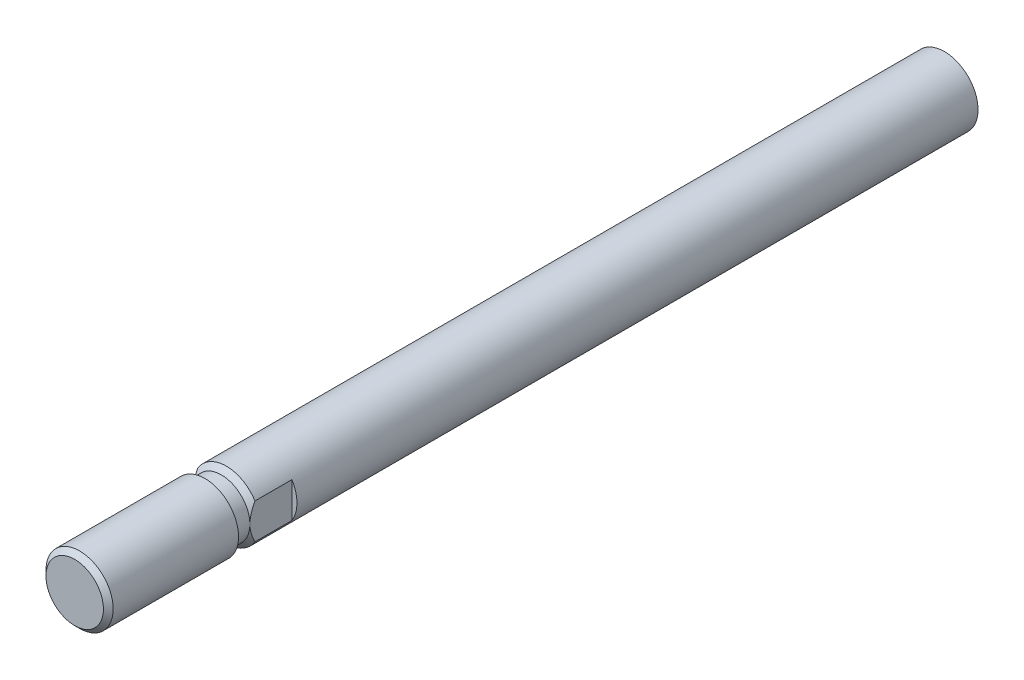
ISO-10303-21;
HEADER;
FILE_DESCRIPTION(('STEP AP214'),'2;1');
FILE_NAME('part.step','',(''),(''),'','','');
FILE_SCHEMA(('AUTOMOTIVE_DESIGN { 1 0 10303 214 1 1 1 1 }'));
ENDSEC;
DATA;
#1=APPLICATION_CONTEXT('core data for automotive mechanical design processes');
#2=APPLICATION_PROTOCOL_DEFINITION('international standard','automotive_design',2000,#1);
#3=PRODUCT_CONTEXT('',#1,'mechanical');
#4=PRODUCT('Part','Part','',(#3));
#5=PRODUCT_RELATED_PRODUCT_CATEGORY('part','',(#4));
#6=PRODUCT_DEFINITION_FORMATION('','',#4);
#7=PRODUCT_DEFINITION_CONTEXT('part definition',#1,'design');
#8=PRODUCT_DEFINITION('design','',#6,#7);
#9=PRODUCT_DEFINITION_SHAPE('','',#8);
#10=(LENGTH_UNIT() NAMED_UNIT(*) SI_UNIT(.MILLI.,.METRE.));
#11=(NAMED_UNIT(*) PLANE_ANGLE_UNIT() SI_UNIT($,.RADIAN.));
#12=(NAMED_UNIT(*) SI_UNIT($,.STERADIAN.) SOLID_ANGLE_UNIT());
#13=UNCERTAINTY_MEASURE_WITH_UNIT(LENGTH_MEASURE(1.E-05),#10,'distance_accuracy_value','');
#14=(GEOMETRIC_REPRESENTATION_CONTEXT(3) GLOBAL_UNCERTAINTY_ASSIGNED_CONTEXT((#13)) GLOBAL_UNIT_ASSIGNED_CONTEXT((#10,
#11,#12)) REPRESENTATION_CONTEXT('',''));
#15=CARTESIAN_POINT('',(0.,0.,0.));
#16=DIRECTION('',(0.,0.,1.));
#17=DIRECTION('',(1.,0.,0.));
#18=AXIS2_PLACEMENT_3D('',#15,#16,#17);
#19=CARTESIAN_POINT('',(0.,0.,61.45));
#20=DIRECTION('',(0.,0.,-1.));
#21=DIRECTION('',(-1.,0.,0.));
#22=AXIS2_PLACEMENT_3D('',#19,#20,#21);
#23=CONICAL_SURFACE('',#22,4.,0.785398163397433);
#24=CARTESIAN_POINT('',(-3.4,-6.5878219458754,58.0365394052063));
#25=CARTESIAN_POINT('',(-3.4,-6.43516483878573,58.1721735388827));
#26=CARTESIAN_POINT('',(-3.4,-6.28203328358908,58.307278839609));
#27=CARTESIAN_POINT('',(-3.4,-5.97456908677552,58.5761487678322));
#28=CARTESIAN_POINT('',(-3.4,-5.82023631661633,58.7099132482437));
#29=CARTESIAN_POINT('',(-3.4,-5.50946218616608,58.9763791654496));
#30=CARTESIAN_POINT('',(-3.4,-5.35301450640604,59.1090732460118));
#31=CARTESIAN_POINT('',(-3.4,-5.03836903359496,59.3723579204279));
#32=CARTESIAN_POINT('',(-3.4,-4.88017132739386,59.502948617885));
#33=CARTESIAN_POINT('',(-3.4,-4.55193046691828,59.7693039339672));
#34=CARTESIAN_POINT('',(-3.4,-4.38175122939598,59.9049013659342));
#35=CARTESIAN_POINT('',(-3.4,-4.03829264817203,60.172107416482));
#36=CARTESIAN_POINT('',(-3.4,-3.86501350856863,60.303716296144));
#37=CARTESIAN_POINT('',(-3.4,-3.51476446724909,60.5612887871298));
#38=CARTESIAN_POINT('',(-3.4,-3.33780168426294,60.687262030229));
#39=CARTESIAN_POINT('',(-3.4,-2.97875124820127,60.931636690709));
#40=CARTESIAN_POINT('',(-3.4,-2.79666552040638,61.0500408993241));
#41=CARTESIAN_POINT('',(-3.4,-2.48285502108162,61.2411701268405));
#42=CARTESIAN_POINT('',(-3.4,-2.35287212439924,61.3167410019718));
#43=CARTESIAN_POINT('',(-3.4,-2.08905852947589,61.4610211361091));
#44=CARTESIAN_POINT('',(-3.4,-1.9552266683874,61.5297282927997));
#45=CARTESIAN_POINT('',(-3.4,-1.6844085539287,61.6574937747855));
#46=CARTESIAN_POINT('',(-3.4,-1.54745996214771,61.7166309810592));
#47=CARTESIAN_POINT('',(-3.4,-1.26905180672446,61.823155809651));
#48=CARTESIAN_POINT('',(-3.4,-1.12759510211247,61.8705507178861));
#49=CARTESIAN_POINT('',(-3.4,-0.885218992938315,61.9379349759706));
#50=CARTESIAN_POINT('',(-3.4,-0.785396522524439,61.9618623921347));
#51=CARTESIAN_POINT('',(-3.4,-0.584138025374428,62.0015948902267));
#52=CARTESIAN_POINT('',(-3.4,-0.482702283496348,62.0174013900179));
#53=CARTESIAN_POINT('',(-3.4,-0.279164763157997,62.0400522092579));
#54=CARTESIAN_POINT('',(-3.4,-0.177066349816273,62.0469263452185));
#55=CARTESIAN_POINT('',(-3.4,0.0273389530064295,62.0514254506055));
#56=CARTESIAN_POINT('',(-3.4,0.12964584441907,62.0490503339396));
#57=CARTESIAN_POINT('',(-3.4,0.333086177366939,62.0352236825696));
#58=CARTESIAN_POINT('',(-3.4,0.434222966747206,62.0238205689356));
#59=CARTESIAN_POINT('',(-3.4,0.635194537026872,61.9926008709949));
#60=CARTESIAN_POINT('',(-3.4,0.735029000059152,61.9727822708539));
#61=CARTESIAN_POINT('',(-3.4,0.933992170496691,61.9253872286602));
#62=CARTESIAN_POINT('',(-3.4,1.0331006387697,61.8977268547021));
#63=CARTESIAN_POINT('',(-3.4,1.22919346075848,61.8358253094709));
#64=CARTESIAN_POINT('',(-3.4,1.32617821312364,61.8015853852687));
#65=CARTESIAN_POINT('',(-3.4,1.55202727156844,61.7144404589539));
#66=CARTESIAN_POINT('',(-3.4,1.67999557074098,61.6592230290004));
#67=CARTESIAN_POINT('',(-3.4,1.93225210900286,61.5408851998133));
#68=CARTESIAN_POINT('',(-3.4,2.05653823694379,61.4777603713498));
#69=CARTESIAN_POINT('',(-3.4,2.30224909620747,61.3451716649328));
#70=CARTESIAN_POINT('',(-3.4,2.42366155172895,61.2756852166232));
#71=CARTESIAN_POINT('',(-3.4,2.66358688395173,61.1319595950889));
#72=CARTESIAN_POINT('',(-3.4,2.78210033173297,61.0577213685168));
#73=CARTESIAN_POINT('',(-3.4,3.01078760711653,60.9093323105076));
#74=CARTESIAN_POINT('',(-3.4,3.1210810734865,60.8353649010318));
#75=CARTESIAN_POINT('',(-3.4,3.33980139105162,60.6847096078359));
#76=CARTESIAN_POINT('',(-3.4,3.4482280904492,60.6080215044178));
#77=CARTESIAN_POINT('',(-3.4,3.66252557724323,60.4531362116732));
#78=CARTESIAN_POINT('',(-3.4,3.76841052929652,60.3749585530628));
#79=CARTESIAN_POINT('',(-3.4,3.97880253424355,60.2168257813109));
#80=CARTESIAN_POINT('',(-3.4,4.08330994339822,60.1368711426946));
#81=CARTESIAN_POINT('',(-3.4,4.18725185941825,60.0562000283472));
#82=B_SPLINE_CURVE_WITH_KNOTS('',3,(#24,#25,#26,#27,#28,#29,#30,#31,#32,#33,#34,#35,#36,#37,#38,
#39,#40,#41,#42,#43,#44,#45,#46,#47,#48,#49,#50,#51,#52,#53,#54,#55,#56,#57,#58,#59,#60,#61,#62,
#63,#64,#65,#66,#67,#68,#69,#70,#71,#72,#73,#74,#75,#76,#77,#78,#79,#80,#81),.UNSPECIFIED.,.F.,
.F.,(4,2,2,2,2,2,2,2,2,2,2,2,2,2,2,2,2,2,2,2,2,2,2,2,2,2,2,2,4),(0.,0.612627167165252,
1.22532081858993,1.84073464995004,2.4561180754938,3.10886008900236,3.76155928285797,
4.41309664854131,5.06439234387836,5.51530342448703,5.96635219566758,6.41346955346702,
6.860308783014,7.16797223390512,7.47558195033027,7.78216219550522,8.0887452943447,
8.39369510399418,8.69871800215612,9.00713756411888,9.3154987265912,9.73325087704229,
10.1512380813149,10.5707704183088,10.990219434369,11.3885708160787,11.7869544384812,
12.1817889285951,12.5765192196432),.UNSPECIFIED.);
#83=CARTESIAN_POINT('',(-3.4,-2.10713075057055,61.45));
#84=VERTEX_POINT('',#83);
#85=CARTESIAN_POINT('',(-3.4,0.,62.05));
#86=VERTEX_POINT('',#85);
#87=EDGE_CURVE('E60',#84,#86,#82,.T.);
#88=ORIENTED_EDGE('',*,*,#87,.F.);
#89=CARTESIAN_POINT('',(0.,0.,61.45));
#90=DIRECTION('',(0.,0.,-1.));
#91=DIRECTION('',(-1.,0.,0.));
#92=AXIS2_PLACEMENT_3D('',#89,#90,#91);
#93=CIRCLE('',#92,4.);
#94=CARTESIAN_POINT('',(3.4,-2.10713075057055,61.45));
#95=VERTEX_POINT('',#94);
#96=EDGE_CURVE('E160',#95,#84,#93,.T.);
#97=ORIENTED_EDGE('',*,*,#96,.F.);
#98=CARTESIAN_POINT('',(3.4,-6.5878219458754,58.0365394052063));
#99=CARTESIAN_POINT('',(3.4,-6.43516483878573,58.1721735388827));
#100=CARTESIAN_POINT('',(3.4,-6.28203328358908,58.307278839609));
#101=CARTESIAN_POINT('',(3.4,-5.97456908677552,58.5761487678322));
#102=CARTESIAN_POINT('',(3.4,-5.82023631661633,58.7099132482436));
#103=CARTESIAN_POINT('',(3.4,-5.50946218616608,58.9763791654496));
#104=CARTESIAN_POINT('',(3.4,-5.35301450640604,59.1090732460118));
#105=CARTESIAN_POINT('',(3.4,-5.03836903359497,59.3723579204279));
#106=CARTESIAN_POINT('',(3.4,-4.88017132739386,59.502948617885));
#107=CARTESIAN_POINT('',(3.4,-4.55193046691828,59.7693039339672));
#108=CARTESIAN_POINT('',(3.4,-4.38175122939598,59.9049013659342));
#109=CARTESIAN_POINT('',(3.4,-4.03829264817204,60.172107416482));
#110=CARTESIAN_POINT('',(3.4,-3.86501350856863,60.303716296144));
#111=CARTESIAN_POINT('',(3.4,-3.51476446724909,60.5612887871298));
#112=CARTESIAN_POINT('',(3.4,-3.33780168426295,60.687262030229));
#113=CARTESIAN_POINT('',(3.4,-2.97875124820127,60.931636690709));
#114=CARTESIAN_POINT('',(3.4,-2.79666552040638,61.0500408993241));
#115=CARTESIAN_POINT('',(3.4,-2.48285502108162,61.2411701268405));
#116=CARTESIAN_POINT('',(3.4,-2.35287212439924,61.3167410019718));
#117=CARTESIAN_POINT('',(3.4,-2.08905852947589,61.4610211361091));
#118=CARTESIAN_POINT('',(3.4,-1.95522666838741,61.5297282927997));
#119=CARTESIAN_POINT('',(3.4,-1.6844085539287,61.6574937747855));
#120=CARTESIAN_POINT('',(3.4,-1.5474599621477,61.7166309810592));
#121=CARTESIAN_POINT('',(3.4,-1.26905180672445,61.823155809651));
#122=CARTESIAN_POINT('',(3.4,-1.12759510211246,61.8705507178861));
#123=CARTESIAN_POINT('',(3.4,-0.885218992938308,61.9379349759706));
#124=CARTESIAN_POINT('',(3.4,-0.785396522524432,61.9618623921347));
#125=CARTESIAN_POINT('',(3.4,-0.584138025374422,62.0015948902267));
#126=CARTESIAN_POINT('',(3.4,-0.482702283496342,62.0174013900179));
#127=CARTESIAN_POINT('',(3.4,-0.27916476315799,62.0400522092579));
#128=CARTESIAN_POINT('',(3.4,-0.177066349816266,62.0469263452185));
#129=CARTESIAN_POINT('',(3.4,0.0273389530064364,62.0514254506055));
#130=CARTESIAN_POINT('',(3.4,0.129645844419076,62.0490503339396));
#131=CARTESIAN_POINT('',(3.4,0.333086177366946,62.0352236825696));
#132=CARTESIAN_POINT('',(3.4,0.434222966747212,62.0238205689356));
#133=CARTESIAN_POINT('',(3.4,0.635194537026879,61.9926008709949));
#134=CARTESIAN_POINT('',(3.4,0.735029000059159,61.9727822708539));
#135=CARTESIAN_POINT('',(3.4,0.933992170496698,61.9253872286602));
#136=CARTESIAN_POINT('',(3.4,1.03310063876971,61.8977268547021));
#137=CARTESIAN_POINT('',(3.4,1.22919346075849,61.8358253094709));
#138=CARTESIAN_POINT('',(3.4,1.32617821312364,61.8015853852687));
#139=CARTESIAN_POINT('',(3.4,1.55202727156844,61.7144404589539));
#140=CARTESIAN_POINT('',(3.4,1.67999557074099,61.6592230290004));
#141=CARTESIAN_POINT('',(3.4,1.93225210900286,61.5408851998133));
#142=CARTESIAN_POINT('',(3.4,2.05653823694379,61.4777603713498));
#143=CARTESIAN_POINT('',(3.4,2.30224909620748,61.3451716649328));
#144=CARTESIAN_POINT('',(3.4,2.42366155172896,61.2756852166232));
#145=CARTESIAN_POINT('',(3.4,2.66358688395174,61.1319595950889));
#146=CARTESIAN_POINT('',(3.4,2.78210033173297,61.0577213685168));
#147=CARTESIAN_POINT('',(3.4,3.01078760711653,60.9093323105076));
#148=CARTESIAN_POINT('',(3.4,3.1210810734865,60.8353649010318));
#149=CARTESIAN_POINT('',(3.4,3.33980139105162,60.6847096078359));
#150=CARTESIAN_POINT('',(3.4,3.4482280904492,60.6080215044178));
#151=CARTESIAN_POINT('',(3.4,3.66252557724323,60.4531362116732));
#152=CARTESIAN_POINT('',(3.4,3.76841052929652,60.3749585530628));
#153=CARTESIAN_POINT('',(3.4,3.97880253424355,60.2168257813109));
#154=CARTESIAN_POINT('',(3.4,4.08330994339822,60.1368711426946));
#155=CARTESIAN_POINT('',(3.4,4.18725185941826,60.0562000283472));
#156=B_SPLINE_CURVE_WITH_KNOTS('',3,(#98,#99,#100,#101,#102,#103,#104,#105,#106,#107,#108,#109,
#110,#111,#112,#113,#114,#115,#116,#117,#118,#119,#120,#121,#122,#123,#124,#125,#126,#127,#128,
#129,#130,#131,#132,#133,#134,#135,#136,#137,#138,#139,#140,#141,#142,#143,#144,#145,#146,#147,
#148,#149,#150,#151,#152,#153,#154,#155),.UNSPECIFIED.,.F.,.F.,(4,2,2,2,2,2,2,2,2,2,2,2,2,2,2,2,
2,2,2,2,2,2,2,2,2,2,2,2,4),(0.,0.612627167165251,1.22532081858992,1.84073464995003,
2.45611807549379,3.10886008900235,3.76155928285797,4.41309664854131,5.06439234387836,
5.51530342448702,5.96635219566758,6.41346955346703,6.86030878301401,7.16797223390513,
7.47558195033028,7.78216219550523,8.08874529434471,8.39369510399419,8.69871800215613,
9.00713756411888,9.3154987265912,9.73325087704228,10.1512380813149,10.5707704183088,
10.990219434369,11.3885708160787,11.7869544384812,12.1817889285951,12.5765192196432),.UNSPECIFIED.);
#157=CARTESIAN_POINT('',(3.4,0.,62.05));
#158=VERTEX_POINT('',#157);
#159=EDGE_CURVE('E87',#158,#95,#156,.F.);
#160=ORIENTED_EDGE('',*,*,#159,.F.);
#161=CARTESIAN_POINT('',(0.,0.,62.05));
#162=DIRECTION('',(0.,0.,-1.));
#163=DIRECTION('',(-1.,0.,0.));
#164=AXIS2_PLACEMENT_3D('',#161,#162,#163);
#165=CIRCLE('',#164,3.4);
#166=EDGE_CURVE('E162',#158,#86,#165,.T.);
#167=ORIENTED_EDGE('',*,*,#166,.T.);
#168=EDGE_LOOP('',(#88,#97,#160,#167));
#169=FACE_BOUND('',#168,.T.);
#170=ADVANCED_FACE('F36',(#169),#23,.T.);
#171=CARTESIAN_POINT('',(0.,0.,64.));
#172=DIRECTION('',(0.,0.,1.));
#173=DIRECTION('',(1.,0.,0.));
#174=AXIS2_PLACEMENT_3D('',#171,#172,#173);
#175=PLANE('',#174);
#176=CARTESIAN_POINT('',(0.,0.,64.));
#177=DIRECTION('',(0.,0.,1.));
#178=DIRECTION('',(1.,0.,0.));
#179=AXIS2_PLACEMENT_3D('',#176,#177,#178);
#180=CIRCLE('',#179,4.);
#181=CARTESIAN_POINT('',(4.,0.,64.));
#182=VERTEX_POINT('',#181);
#183=EDGE_CURVE('E176',#182,#182,#180,.T.);
#184=ORIENTED_EDGE('',*,*,#183,.F.);
#185=EDGE_LOOP('',(#184));
#186=FACE_BOUND('',#185,.T.);
#187=CARTESIAN_POINT('',(0.,0.,64.));
#188=DIRECTION('',(0.,0.,1.));
#189=DIRECTION('',(1.,0.,0.));
#190=AXIS2_PLACEMENT_3D('',#187,#188,#189);
#191=CIRCLE('',#190,3.4);
#192=CARTESIAN_POINT('',(3.4,0.,64.));
#193=VERTEX_POINT('',#192);
#194=EDGE_CURVE('E173',#193,#193,#191,.F.);
#195=ORIENTED_EDGE('',*,*,#194,.F.);
#196=EDGE_LOOP('',(#195));
#197=FACE_BOUND('',#196,.T.);
#198=ADVANCED_FACE('F137',(#186,#197),#175,.F.);
#199=CARTESIAN_POINT('',(0.,0.,64.));
#200=DIRECTION('',(0.,0.,1.));
#201=DIRECTION('',(1.,0.,0.));
#202=AXIS2_PLACEMENT_3D('',#199,#200,#201);
#203=CYLINDRICAL_SURFACE('',#202,4.);
#204=CARTESIAN_POINT('',(0.,0.,78.92));
#205=DIRECTION('',(0.,0.,1.));
#206=DIRECTION('',(1.,0.,0.));
#207=AXIS2_PLACEMENT_3D('',#204,#205,#206);
#208=CIRCLE('',#207,4.);
#209=CARTESIAN_POINT('',(4.,0.,78.92));
#210=VERTEX_POINT('',#209);
#211=EDGE_CURVE('E166',#210,#210,#208,.F.);
#212=ORIENTED_EDGE('',*,*,#211,.T.);
#213=EDGE_LOOP('',(#212));
#214=FACE_BOUND('',#213,.T.);
#215=ORIENTED_EDGE('',*,*,#183,.T.);
#216=EDGE_LOOP('',(#215));
#217=FACE_BOUND('',#216,.T.);
#218=ADVANCED_FACE('F140',(#214,#217),#203,.T.);
#219=CARTESIAN_POINT('',(0.,0.,79.5));
#220=DIRECTION('',(0.,0.,1.));
#221=DIRECTION('',(1.,0.,0.));
#222=AXIS2_PLACEMENT_3D('',#219,#220,#221);
#223=PLANE('',#222);
#224=CARTESIAN_POINT('',(0.,0.,79.5));
#225=DIRECTION('',(0.,0.,1.));
#226=DIRECTION('',(1.,0.,0.));
#227=AXIS2_PLACEMENT_3D('',#224,#225,#226);
#228=CIRCLE('',#227,3.41999999999996);
#229=CARTESIAN_POINT('',(3.41999999999996,0.,79.5));
#230=VERTEX_POINT('',#229);
#231=EDGE_CURVE('E168',#230,#230,#228,.T.);
#232=ORIENTED_EDGE('',*,*,#231,.T.);
#233=EDGE_LOOP('',(#232));
#234=FACE_BOUND('',#233,.T.);
#235=ADVANCED_FACE('F135',(#234),#223,.T.);
#236=CARTESIAN_POINT('',(0.,0.,62.05));
#237=DIRECTION('',(0.,0.,1.));
#238=DIRECTION('',(1.,0.,0.));
#239=AXIS2_PLACEMENT_3D('',#236,#237,#238);
#240=CYLINDRICAL_SURFACE('',#239,3.4);
#241=EDGE_CURVE('E179',#86,#158,#165,.T.);
#242=ORIENTED_EDGE('',*,*,#241,.F.);
#243=ORIENTED_EDGE('',*,*,#166,.F.);
#244=EDGE_LOOP('',(#242,#243));
#245=FACE_BOUND('',#244,.T.);
#246=ORIENTED_EDGE('',*,*,#194,.T.);
#247=EDGE_LOOP('',(#246));
#248=FACE_BOUND('',#247,.T.);
#249=ADVANCED_FACE('F132',(#245,#248),#240,.T.);
#250=CARTESIAN_POINT('',(0.,0.,-24.));
#251=DIRECTION('',(0.,0.,1.));
#252=DIRECTION('',(1.,0.,0.));
#253=AXIS2_PLACEMENT_3D('',#250,#251,#252);
#254=CYLINDRICAL_SURFACE('',#253,4.);
#255=CARTESIAN_POINT('',(0.,0.,57.05));
#256=DIRECTION('',(0.,0.,1.));
#257=DIRECTION('',(1.,0.,0.));
#258=AXIS2_PLACEMENT_3D('',#255,#256,#257);
#259=CIRCLE('',#258,4.);
#260=CARTESIAN_POINT('',(-3.4,2.10713075057055,57.05));
#261=VERTEX_POINT('',#260);
#262=CARTESIAN_POINT('',(-3.4,-2.10713075057055,57.05));
#263=VERTEX_POINT('',#262);
#264=EDGE_CURVE('E12',#261,#263,#259,.T.);
#265=ORIENTED_EDGE('',*,*,#264,.F.);
#266=DIRECTION('',(0.,0.,1.));
#267=VECTOR('',#266,1.);
#268=CARTESIAN_POINT('',(-3.4,2.10713075057055,-24.));
#269=LINE('',#268,#267);
#270=CARTESIAN_POINT('',(-3.4,2.10713075057055,61.45));
#271=VERTEX_POINT('',#270);
#272=EDGE_CURVE('E185',#261,#271,#269,.T.);
#273=ORIENTED_EDGE('',*,*,#272,.T.);
#274=CARTESIAN_POINT('',(3.4,2.10713075057055,61.45));
#275=VERTEX_POINT('',#274);
#276=EDGE_CURVE('E165',#271,#275,#93,.T.);
#277=ORIENTED_EDGE('',*,*,#276,.T.);
#278=DIRECTION('',(0.,0.,1.));
#279=VECTOR('',#278,1.);
#280=CARTESIAN_POINT('',(3.4,2.10713075057055,-24.));
#281=LINE('',#280,#279);
#282=CARTESIAN_POINT('',(3.4,2.10713075057055,57.05));
#283=VERTEX_POINT('',#282);
#284=EDGE_CURVE('E93',#275,#283,#281,.F.);
#285=ORIENTED_EDGE('',*,*,#284,.T.);
#286=CARTESIAN_POINT('',(3.4,-2.10713075057055,57.05));
#287=VERTEX_POINT('',#286);
#288=EDGE_CURVE('E41',#287,#283,#259,.T.);
#289=ORIENTED_EDGE('',*,*,#288,.F.);
#290=DIRECTION('',(0.,0.,1.));
#291=VECTOR('',#290,1.);
#292=CARTESIAN_POINT('',(3.4,-2.10713075057055,-24.));
#293=LINE('',#292,#291);
#294=EDGE_CURVE('E82',#287,#95,#293,.T.);
#295=ORIENTED_EDGE('',*,*,#294,.T.);
#296=ORIENTED_EDGE('',*,*,#96,.T.);
#297=DIRECTION('',(0.,0.,1.));
#298=VECTOR('',#297,1.);
#299=CARTESIAN_POINT('',(-3.4,-2.10713075057055,-24.));
#300=LINE('',#299,#298);
#301=EDGE_CURVE('E92',#84,#263,#300,.F.);
#302=ORIENTED_EDGE('',*,*,#301,.T.);
#303=EDGE_LOOP('',(#265,#273,#277,#285,#289,#295,#296,#302));
#304=FACE_BOUND('',#303,.T.);
#305=CARTESIAN_POINT('',(0.,0.,-24.));
#306=DIRECTION('',(0.,0.,-1.));
#307=DIRECTION('',(-1.,0.,0.));
#308=AXIS2_PLACEMENT_3D('',#305,#306,#307);
#309=CIRCLE('',#308,4.);
#310=CARTESIAN_POINT('',(-4.,0.,-24.));
#311=VERTEX_POINT('',#310);
#312=EDGE_CURVE('E182',#311,#311,#309,.T.);
#313=ORIENTED_EDGE('',*,*,#312,.F.);
#314=EDGE_LOOP('',(#313));
#315=FACE_BOUND('',#314,.T.);
#316=ADVANCED_FACE('F100',(#304,#315),#254,.T.);
#317=CARTESIAN_POINT('',(0.,0.,-24.));
#318=DIRECTION('',(0.,0.,-1.));
#319=DIRECTION('',(-1.,0.,0.));
#320=AXIS2_PLACEMENT_3D('',#317,#318,#319);
#321=PLANE('',#320);
#322=ORIENTED_EDGE('',*,*,#312,.T.);
#323=EDGE_LOOP('',(#322));
#324=FACE_BOUND('',#323,.T.);
#325=ADVANCED_FACE('F125',(#324),#321,.T.);
#326=CARTESIAN_POINT('',(0.,0.,79.5));
#327=DIRECTION('',(0.,0.,-1.));
#328=DIRECTION('',(-1.,0.,0.));
#329=AXIS2_PLACEMENT_3D('',#326,#327,#328);
#330=CONICAL_SURFACE('',#329,3.41999999999996,0.785398163397456);
#331=ORIENTED_EDGE('',*,*,#211,.F.);
#332=EDGE_LOOP('',(#331));
#333=FACE_BOUND('',#332,.T.);
#334=ORIENTED_EDGE('',*,*,#231,.F.);
#335=EDGE_LOOP('',(#334));
#336=FACE_BOUND('',#335,.T.);
#337=ADVANCED_FACE('F128',(#333,#336),#330,.T.);
#338=EDGE_CURVE('E103',#86,#271,#82,.T.);
#339=ORIENTED_EDGE('',*,*,#338,.F.);
#340=ORIENTED_EDGE('',*,*,#241,.T.);
#341=EDGE_CURVE('E52',#275,#158,#156,.F.);
#342=ORIENTED_EDGE('',*,*,#341,.F.);
#343=ORIENTED_EDGE('',*,*,#276,.F.);
#344=EDGE_LOOP('',(#339,#340,#342,#343));
#345=FACE_BOUND('',#344,.T.);
#346=ADVANCED_FACE('F38',(#345),#23,.T.);
#347=CARTESIAN_POINT('',(3.4,7.50555349946516,62.05));
#348=DIRECTION('',(-1.,0.,0.));
#349=DIRECTION('',(0.,-1.,0.));
#350=AXIS2_PLACEMENT_3D('',#347,#348,#349);
#351=PLANE('',#350);
#352=DIRECTION('',(0.,1.,0.));
#353=VECTOR('',#352,1.);
#354=CARTESIAN_POINT('',(3.4,7.50555349946516,57.05));
#355=LINE('',#354,#353);
#356=EDGE_CURVE('E85',#287,#283,#355,.T.);
#357=ORIENTED_EDGE('',*,*,#356,.T.);
#358=ORIENTED_EDGE('',*,*,#284,.F.);
#359=ORIENTED_EDGE('',*,*,#341,.T.);
#360=ORIENTED_EDGE('',*,*,#159,.T.);
#361=ORIENTED_EDGE('',*,*,#294,.F.);
#362=EDGE_LOOP('',(#357,#358,#359,#360,#361));
#363=FACE_BOUND('',#362,.T.);
#364=ADVANCED_FACE('F84',(#363),#351,.F.);
#365=CARTESIAN_POINT('',(0.,0.,57.05));
#366=DIRECTION('',(0.,0.,1.));
#367=DIRECTION('',(1.,0.,0.));
#368=AXIS2_PLACEMENT_3D('',#365,#366,#367);
#369=PLANE('',#368);
#370=ORIENTED_EDGE('',*,*,#288,.T.);
#371=ORIENTED_EDGE('',*,*,#356,.F.);
#372=EDGE_LOOP('',(#370,#371));
#373=FACE_BOUND('',#372,.T.);
#374=ADVANCED_FACE('F96',(#373),#369,.T.);
#375=ORIENTED_EDGE('',*,*,#264,.T.);
#376=DIRECTION('',(0.,-1.,0.));
#377=VECTOR('',#376,1.);
#378=CARTESIAN_POINT('',(-3.4,7.50555349946516,57.05));
#379=LINE('',#378,#377);
#380=EDGE_CURVE('E97',#261,#263,#379,.T.);
#381=ORIENTED_EDGE('',*,*,#380,.F.);
#382=EDGE_LOOP('',(#375,#381));
#383=FACE_BOUND('',#382,.T.);
#384=ADVANCED_FACE('F120',(#383),#369,.T.);
#385=CARTESIAN_POINT('',(-3.4,7.50555349946516,62.05));
#386=DIRECTION('',(1.,0.,0.));
#387=DIRECTION('',(0.,1.,0.));
#388=AXIS2_PLACEMENT_3D('',#385,#386,#387);
#389=PLANE('',#388);
#390=ORIENTED_EDGE('',*,*,#380,.T.);
#391=ORIENTED_EDGE('',*,*,#301,.F.);
#392=ORIENTED_EDGE('',*,*,#87,.T.);
#393=ORIENTED_EDGE('',*,*,#338,.T.);
#394=ORIENTED_EDGE('',*,*,#272,.F.);
#395=EDGE_LOOP('',(#390,#391,#392,#393,#394));
#396=FACE_BOUND('',#395,.T.);
#397=ADVANCED_FACE('F116',(#396),#389,.F.);
#398=CLOSED_SHELL('',(#170,#198,#218,#235,#249,#316,#325,#337,#346,#364,#374,#384,#397));
#399=MANIFOLD_SOLID_BREP('B2',#398);
#400=ADVANCED_BREP_SHAPE_REPRESENTATION('',(#18,#399),#14);
#401=SHAPE_DEFINITION_REPRESENTATION(#9,#400);
ENDSEC;
END-ISO-10303-21;
